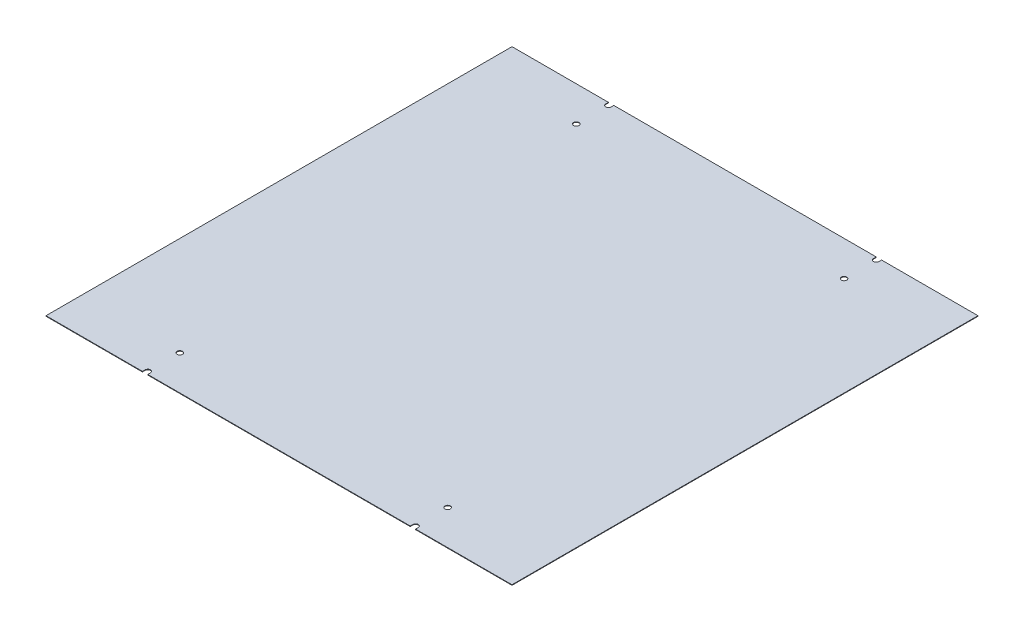
ISO-10303-21;
HEADER;
FILE_DESCRIPTION(('STEP AP214'),'2;1');
FILE_NAME('part.step','',(''),(''),'','','');
FILE_SCHEMA(('AUTOMOTIVE_DESIGN { 1 0 10303 214 1 1 1 1 }'));
ENDSEC;
DATA;
#1=APPLICATION_CONTEXT('core data for automotive mechanical design processes');
#2=APPLICATION_PROTOCOL_DEFINITION('international standard','automotive_design',2000,#1);
#3=PRODUCT_CONTEXT('',#1,'mechanical');
#4=PRODUCT('Part','Part','',(#3));
#5=PRODUCT_RELATED_PRODUCT_CATEGORY('part','',(#4));
#6=PRODUCT_DEFINITION_FORMATION('','',#4);
#7=PRODUCT_DEFINITION_CONTEXT('part definition',#1,'design');
#8=PRODUCT_DEFINITION('design','',#6,#7);
#9=PRODUCT_DEFINITION_SHAPE('','',#8);
#10=(LENGTH_UNIT() NAMED_UNIT(*) SI_UNIT(.MILLI.,.METRE.));
#11=(NAMED_UNIT(*) PLANE_ANGLE_UNIT() SI_UNIT($,.RADIAN.));
#12=(NAMED_UNIT(*) SI_UNIT($,.STERADIAN.) SOLID_ANGLE_UNIT());
#13=UNCERTAINTY_MEASURE_WITH_UNIT(LENGTH_MEASURE(1.E-05),#10,'distance_accuracy_value','');
#14=(GEOMETRIC_REPRESENTATION_CONTEXT(3) GLOBAL_UNCERTAINTY_ASSIGNED_CONTEXT((#13)) GLOBAL_UNIT_ASSIGNED_CONTEXT((#10,
#11,#12)) REPRESENTATION_CONTEXT('',''));
#15=CARTESIAN_POINT('',(0.,0.,0.));
#16=DIRECTION('',(0.,0.,1.));
#17=DIRECTION('',(1.,0.,0.));
#18=AXIS2_PLACEMENT_3D('',#15,#16,#17);
#19=CARTESIAN_POINT('',(490.000000000007,2.,4.08006961549746E-12));
#20=DIRECTION('',(1.,0.,0.));
#21=DIRECTION('',(0.,0.,-1.));
#22=AXIS2_PLACEMENT_3D('',#19,#20,#21);
#23=PLANE('',#22);
#24=DIRECTION('',(0.,0.,1.));
#25=VECTOR('',#24,1.);
#26=CARTESIAN_POINT('',(490.000000000007,0.,4.08006961549746E-12));
#27=LINE('',#26,#25);
#28=CARTESIAN_POINT('',(490.,0.,860.));
#29=VERTEX_POINT('',#28);
#30=CARTESIAN_POINT('',(490.,0.,870.));
#31=VERTEX_POINT('',#30);
#32=EDGE_CURVE('E428',#29,#31,#27,.T.);
#33=ORIENTED_EDGE('',*,*,#32,.F.);
#34=DIRECTION('',(0.,-1.,0.));
#35=VECTOR('',#34,1.);
#36=CARTESIAN_POINT('',(490.,2.,860.));
#37=LINE('',#36,#35);
#38=CARTESIAN_POINT('',(490.,2.,860.));
#39=VERTEX_POINT('',#38);
#40=EDGE_CURVE('E225',#29,#39,#37,.F.);
#41=ORIENTED_EDGE('',*,*,#40,.T.);
#42=DIRECTION('',(0.,0.,1.));
#43=VECTOR('',#42,1.);
#44=CARTESIAN_POINT('',(490.000000000007,2.,4.08006961549746E-12));
#45=LINE('',#44,#43);
#46=CARTESIAN_POINT('',(490.,2.,870.));
#47=VERTEX_POINT('',#46);
#48=EDGE_CURVE('E210',#39,#47,#45,.T.);
#49=ORIENTED_EDGE('',*,*,#48,.T.);
#50=DIRECTION('',(0.,-1.,0.));
#51=VECTOR('',#50,1.);
#52=CARTESIAN_POINT('',(490.,2.,870.));
#53=LINE('',#52,#51);
#54=EDGE_CURVE('E330',#47,#31,#53,.T.);
#55=ORIENTED_EDGE('',*,*,#54,.T.);
#56=EDGE_LOOP('',(#33,#41,#49,#55));
#57=FACE_BOUND('',#56,.T.);
#58=ADVANCED_FACE('F39',(#57),#23,.T.);
#59=CARTESIAN_POINT('',(510.00000000001,2.,5.66213742558834E-12));
#60=DIRECTION('',(1.,0.,0.));
#61=DIRECTION('',(0.,0.,-1.));
#62=AXIS2_PLACEMENT_3D('',#59,#60,#61);
#63=PLANE('',#62);
#64=DIRECTION('',(0.,0.,1.));
#65=VECTOR('',#64,1.);
#66=CARTESIAN_POINT('',(510.00000000001,2.,5.66213742558834E-12));
#67=LINE('',#66,#65);
#68=CARTESIAN_POINT('',(510.,2.,860.));
#69=VERTEX_POINT('',#68);
#70=CARTESIAN_POINT('',(510.,2.,870.));
#71=VERTEX_POINT('',#70);
#72=EDGE_CURVE('E199',#69,#71,#67,.T.);
#73=ORIENTED_EDGE('',*,*,#72,.F.);
#74=DIRECTION('',(0.,-1.,0.));
#75=VECTOR('',#74,1.);
#76=CARTESIAN_POINT('',(510.,0.,860.));
#77=LINE('',#76,#75);
#78=CARTESIAN_POINT('',(510.,0.,860.));
#79=VERTEX_POINT('',#78);
#80=EDGE_CURVE('E228',#69,#79,#77,.T.);
#81=ORIENTED_EDGE('',*,*,#80,.T.);
#82=DIRECTION('',(0.,0.,1.));
#83=VECTOR('',#82,1.);
#84=CARTESIAN_POINT('',(510.00000000001,0.,5.66213742558834E-12));
#85=LINE('',#84,#83);
#86=CARTESIAN_POINT('',(510.,0.,870.));
#87=VERTEX_POINT('',#86);
#88=EDGE_CURVE('E223',#79,#87,#85,.T.);
#89=ORIENTED_EDGE('',*,*,#88,.T.);
#90=DIRECTION('',(0.,-1.,0.));
#91=VECTOR('',#90,1.);
#92=CARTESIAN_POINT('',(510.,2.,870.));
#93=LINE('',#92,#91);
#94=EDGE_CURVE('E216',#71,#87,#93,.T.);
#95=ORIENTED_EDGE('',*,*,#94,.F.);
#96=EDGE_LOOP('',(#73,#81,#89,#95));
#97=FACE_BOUND('',#96,.T.);
#98=ADVANCED_FACE('F221',(#97),#63,.F.);
#99=CARTESIAN_POINT('',(0.,2.,870.));
#100=DIRECTION('',(0.,0.,-1.));
#101=DIRECTION('',(-1.,0.,0.));
#102=AXIS2_PLACEMENT_3D('',#99,#100,#101);
#103=PLANE('',#102);
#104=DIRECTION('',(1.,0.,0.));
#105=VECTOR('',#104,1.);
#106=CARTESIAN_POINT('',(0.,0.,870.));
#107=LINE('',#106,#105);
#108=CARTESIAN_POINT('',(870.,0.,870.));
#109=VERTEX_POINT('',#108);
#110=EDGE_CURVE('E364',#87,#109,#107,.T.);
#111=ORIENTED_EDGE('',*,*,#110,.T.);
#112=DIRECTION('',(0.,-1.,0.));
#113=VECTOR('',#112,1.);
#114=CARTESIAN_POINT('',(870.,2.,870.));
#115=LINE('',#114,#113);
#116=CARTESIAN_POINT('',(870.,2.,870.));
#117=VERTEX_POINT('',#116);
#118=EDGE_CURVE('E217',#117,#109,#115,.T.);
#119=ORIENTED_EDGE('',*,*,#118,.F.);
#120=DIRECTION('',(1.,0.,0.));
#121=VECTOR('',#120,1.);
#122=CARTESIAN_POINT('',(0.,2.,870.));
#123=LINE('',#122,#121);
#124=EDGE_CURVE('E203',#71,#117,#123,.T.);
#125=ORIENTED_EDGE('',*,*,#124,.F.);
#126=ORIENTED_EDGE('',*,*,#94,.T.);
#127=EDGE_LOOP('',(#111,#119,#125,#126));
#128=FACE_BOUND('',#127,.T.);
#129=ADVANCED_FACE('F215',(#128),#103,.F.);
#130=CARTESIAN_POINT('',(870.,2.,-1.11022302462516E-13));
#131=DIRECTION('',(1.,0.,0.));
#132=DIRECTION('',(0.,0.,-1.));
#133=AXIS2_PLACEMENT_3D('',#130,#131,#132);
#134=PLANE('',#133);
#135=DIRECTION('',(0.,0.,1.));
#136=VECTOR('',#135,1.);
#137=CARTESIAN_POINT('',(870.,0.,-1.11022302462516E-13));
#138=LINE('',#137,#136);
#139=CARTESIAN_POINT('',(870.,0.,-870.));
#140=VERTEX_POINT('',#139);
#141=EDGE_CURVE('E362',#140,#109,#138,.T.);
#142=ORIENTED_EDGE('',*,*,#141,.F.);
#143=DIRECTION('',(0.,-1.,0.));
#144=VECTOR('',#143,1.);
#145=CARTESIAN_POINT('',(870.,2.,-870.));
#146=LINE('',#145,#144);
#147=CARTESIAN_POINT('',(870.,2.,-870.));
#148=VERTEX_POINT('',#147);
#149=EDGE_CURVE('E230',#148,#140,#146,.T.);
#150=ORIENTED_EDGE('',*,*,#149,.F.);
#151=DIRECTION('',(0.,0.,1.));
#152=VECTOR('',#151,1.);
#153=CARTESIAN_POINT('',(870.,2.,-1.11022302462516E-13));
#154=LINE('',#153,#152);
#155=EDGE_CURVE('E219',#148,#117,#154,.T.);
#156=ORIENTED_EDGE('',*,*,#155,.T.);
#157=ORIENTED_EDGE('',*,*,#118,.T.);
#158=EDGE_LOOP('',(#142,#150,#156,#157));
#159=FACE_BOUND('',#158,.T.);
#160=ADVANCED_FACE('F363',(#159),#134,.T.);
#161=CARTESIAN_POINT('',(0.,2.,-870.));
#162=DIRECTION('',(0.,0.,-1.));
#163=DIRECTION('',(-1.,0.,0.));
#164=AXIS2_PLACEMENT_3D('',#161,#162,#163);
#165=PLANE('',#164);
#166=DIRECTION('',(1.,0.,0.));
#167=VECTOR('',#166,1.);
#168=CARTESIAN_POINT('',(0.,0.,-870.));
#169=LINE('',#168,#167);
#170=CARTESIAN_POINT('',(510.,0.,-870.));
#171=VERTEX_POINT('',#170);
#172=EDGE_CURVE('E357',#171,#140,#169,.T.);
#173=ORIENTED_EDGE('',*,*,#172,.F.);
#174=DIRECTION('',(0.,-1.,0.));
#175=VECTOR('',#174,1.);
#176=CARTESIAN_POINT('',(510.,2.,-870.));
#177=LINE('',#176,#175);
#178=CARTESIAN_POINT('',(510.,2.,-870.));
#179=VERTEX_POINT('',#178);
#180=EDGE_CURVE('E350',#179,#171,#177,.T.);
#181=ORIENTED_EDGE('',*,*,#180,.F.);
#182=DIRECTION('',(1.,0.,0.));
#183=VECTOR('',#182,1.);
#184=CARTESIAN_POINT('',(0.,2.,-870.));
#185=LINE('',#184,#183);
#186=EDGE_CURVE('E359',#179,#148,#185,.T.);
#187=ORIENTED_EDGE('',*,*,#186,.T.);
#188=ORIENTED_EDGE('',*,*,#149,.T.);
#189=EDGE_LOOP('',(#173,#181,#187,#188));
#190=FACE_BOUND('',#189,.T.);
#191=ADVANCED_FACE('F355',(#190),#165,.T.);
#192=CARTESIAN_POINT('',(509.99999999999,2.,5.66213742558812E-12));
#193=DIRECTION('',(1.,0.,0.));
#194=DIRECTION('',(0.,0.,-1.));
#195=AXIS2_PLACEMENT_3D('',#192,#193,#194);
#196=PLANE('',#195);
#197=DIRECTION('',(0.,0.,1.));
#198=VECTOR('',#197,1.);
#199=CARTESIAN_POINT('',(509.99999999999,0.,5.66213742558812E-12));
#200=LINE('',#199,#198);
#201=CARTESIAN_POINT('',(510.,0.,-860.));
#202=VERTEX_POINT('',#201);
#203=EDGE_CURVE('E368',#171,#202,#200,.T.);
#204=ORIENTED_EDGE('',*,*,#203,.T.);
#205=DIRECTION('',(0.,-1.,0.));
#206=VECTOR('',#205,1.);
#207=CARTESIAN_POINT('',(510.,2.,-860.));
#208=LINE('',#207,#206);
#209=CARTESIAN_POINT('',(510.,2.,-860.));
#210=VERTEX_POINT('',#209);
#211=EDGE_CURVE('E240',#202,#210,#208,.F.);
#212=ORIENTED_EDGE('',*,*,#211,.T.);
#213=DIRECTION('',(0.,0.,1.));
#214=VECTOR('',#213,1.);
#215=CARTESIAN_POINT('',(509.99999999999,2.,5.66213742558812E-12));
#216=LINE('',#215,#214);
#217=EDGE_CURVE('E386',#179,#210,#216,.T.);
#218=ORIENTED_EDGE('',*,*,#217,.F.);
#219=ORIENTED_EDGE('',*,*,#180,.T.);
#220=EDGE_LOOP('',(#204,#212,#218,#219));
#221=FACE_BOUND('',#220,.T.);
#222=ADVANCED_FACE('F383',(#221),#196,.F.);
#223=CARTESIAN_POINT('',(489.999999999993,2.,4.08006961549734E-12));
#224=DIRECTION('',(1.,0.,0.));
#225=DIRECTION('',(0.,0.,-1.));
#226=AXIS2_PLACEMENT_3D('',#223,#224,#225);
#227=PLANE('',#226);
#228=DIRECTION('',(0.,0.,1.));
#229=VECTOR('',#228,1.);
#230=CARTESIAN_POINT('',(489.999999999993,2.,4.08006961549734E-12));
#231=LINE('',#230,#229);
#232=CARTESIAN_POINT('',(490.,2.,-870.));
#233=VERTEX_POINT('',#232);
#234=CARTESIAN_POINT('',(490.,2.,-860.));
#235=VERTEX_POINT('',#234);
#236=EDGE_CURVE('E387',#233,#235,#231,.T.);
#237=ORIENTED_EDGE('',*,*,#236,.T.);
#238=DIRECTION('',(0.,-1.,0.));
#239=VECTOR('',#238,1.);
#240=CARTESIAN_POINT('',(490.,0.,-860.));
#241=LINE('',#240,#239);
#242=CARTESIAN_POINT('',(490.,0.,-860.));
#243=VERTEX_POINT('',#242);
#244=EDGE_CURVE('E243',#235,#243,#241,.T.);
#245=ORIENTED_EDGE('',*,*,#244,.T.);
#246=DIRECTION('',(0.,0.,1.));
#247=VECTOR('',#246,1.);
#248=CARTESIAN_POINT('',(489.999999999993,0.,4.08006961549734E-12));
#249=LINE('',#248,#247);
#250=CARTESIAN_POINT('',(490.,0.,-870.));
#251=VERTEX_POINT('',#250);
#252=EDGE_CURVE('E310',#251,#243,#249,.T.);
#253=ORIENTED_EDGE('',*,*,#252,.F.);
#254=DIRECTION('',(0.,-1.,0.));
#255=VECTOR('',#254,1.);
#256=CARTESIAN_POINT('',(490.,2.,-870.));
#257=LINE('',#256,#255);
#258=EDGE_CURVE('E348',#233,#251,#257,.T.);
#259=ORIENTED_EDGE('',*,*,#258,.F.);
#260=EDGE_LOOP('',(#237,#245,#253,#259));
#261=FACE_BOUND('',#260,.T.);
#262=ADVANCED_FACE('F629',(#261),#227,.T.);
#263=CARTESIAN_POINT('',(-1.97121230902834E-13,2.,-870.));
#264=DIRECTION('',(0.,0.,-1.));
#265=DIRECTION('',(-1.,0.,0.));
#266=AXIS2_PLACEMENT_3D('',#263,#264,#265);
#267=PLANE('',#266);
#268=DIRECTION('',(1.,0.,0.));
#269=VECTOR('',#268,1.);
#270=CARTESIAN_POINT('',(-1.97121230902834E-13,0.,-870.));
#271=LINE('',#270,#269);
#272=CARTESIAN_POINT('',(-490.,0.,-870.));
#273=VERTEX_POINT('',#272);
#274=EDGE_CURVE('E306',#273,#251,#271,.T.);
#275=ORIENTED_EDGE('',*,*,#274,.F.);
#276=DIRECTION('',(0.,-1.,0.));
#277=VECTOR('',#276,1.);
#278=CARTESIAN_POINT('',(-490.,2.,-870.));
#279=LINE('',#278,#277);
#280=CARTESIAN_POINT('',(-490.,2.,-870.));
#281=VERTEX_POINT('',#280);
#282=EDGE_CURVE('E304',#281,#273,#279,.T.);
#283=ORIENTED_EDGE('',*,*,#282,.F.);
#284=DIRECTION('',(1.,0.,0.));
#285=VECTOR('',#284,1.);
#286=CARTESIAN_POINT('',(-1.97121230902834E-13,2.,-870.));
#287=LINE('',#286,#285);
#288=EDGE_CURVE('E394',#281,#233,#287,.T.);
#289=ORIENTED_EDGE('',*,*,#288,.T.);
#290=ORIENTED_EDGE('',*,*,#258,.T.);
#291=EDGE_LOOP('',(#275,#283,#289,#290));
#292=FACE_BOUND('',#291,.T.);
#293=ADVANCED_FACE('F624',(#292),#267,.T.);
#294=CARTESIAN_POINT('',(-490.,2.,0.));
#295=DIRECTION('',(1.,0.,0.));
#296=DIRECTION('',(0.,0.,-1.));
#297=AXIS2_PLACEMENT_3D('',#294,#295,#296);
#298=PLANE('',#297);
#299=DIRECTION('',(0.,0.,1.));
#300=VECTOR('',#299,1.);
#301=CARTESIAN_POINT('',(-490.,0.,0.));
#302=LINE('',#301,#300);
#303=CARTESIAN_POINT('',(-490.,0.,-860.));
#304=VERTEX_POINT('',#303);
#305=EDGE_CURVE('E299',#273,#304,#302,.T.);
#306=ORIENTED_EDGE('',*,*,#305,.T.);
#307=DIRECTION('',(0.,-1.,0.));
#308=VECTOR('',#307,1.);
#309=CARTESIAN_POINT('',(-490.,2.,-860.));
#310=LINE('',#309,#308);
#311=CARTESIAN_POINT('',(-490.,2.,-860.));
#312=VERTEX_POINT('',#311);
#313=EDGE_CURVE('E248',#304,#312,#310,.F.);
#314=ORIENTED_EDGE('',*,*,#313,.T.);
#315=DIRECTION('',(0.,0.,1.));
#316=VECTOR('',#315,1.);
#317=CARTESIAN_POINT('',(-490.,2.,0.));
#318=LINE('',#317,#316);
#319=EDGE_CURVE('E397',#281,#312,#318,.T.);
#320=ORIENTED_EDGE('',*,*,#319,.F.);
#321=ORIENTED_EDGE('',*,*,#282,.T.);
#322=EDGE_LOOP('',(#306,#314,#320,#321));
#323=FACE_BOUND('',#322,.T.);
#324=ADVANCED_FACE('F302',(#323),#298,.F.);
#325=CARTESIAN_POINT('',(-510.,2.,0.));
#326=DIRECTION('',(1.,0.,0.));
#327=DIRECTION('',(0.,0.,-1.));
#328=AXIS2_PLACEMENT_3D('',#325,#326,#327);
#329=PLANE('',#328);
#330=DIRECTION('',(0.,0.,1.));
#331=VECTOR('',#330,1.);
#332=CARTESIAN_POINT('',(-510.,2.,0.));
#333=LINE('',#332,#331);
#334=CARTESIAN_POINT('',(-510.,2.,-870.));
#335=VERTEX_POINT('',#334);
#336=CARTESIAN_POINT('',(-510.,2.,-860.));
#337=VERTEX_POINT('',#336);
#338=EDGE_CURVE('E399',#335,#337,#333,.T.);
#339=ORIENTED_EDGE('',*,*,#338,.T.);
#340=DIRECTION('',(0.,-1.,0.));
#341=VECTOR('',#340,1.);
#342=CARTESIAN_POINT('',(-510.,0.,-860.));
#343=LINE('',#342,#341);
#344=CARTESIAN_POINT('',(-510.,0.,-860.));
#345=VERTEX_POINT('',#344);
#346=EDGE_CURVE('E245',#337,#345,#343,.T.);
#347=ORIENTED_EDGE('',*,*,#346,.T.);
#348=DIRECTION('',(0.,0.,1.));
#349=VECTOR('',#348,1.);
#350=CARTESIAN_POINT('',(-510.,0.,0.));
#351=LINE('',#350,#349);
#352=CARTESIAN_POINT('',(-510.,0.,-870.));
#353=VERTEX_POINT('',#352);
#354=EDGE_CURVE('E305',#353,#345,#351,.T.);
#355=ORIENTED_EDGE('',*,*,#354,.F.);
#356=DIRECTION('',(0.,-1.,0.));
#357=VECTOR('',#356,1.);
#358=CARTESIAN_POINT('',(-510.,2.,-870.));
#359=LINE('',#358,#357);
#360=EDGE_CURVE('E345',#335,#353,#359,.T.);
#361=ORIENTED_EDGE('',*,*,#360,.F.);
#362=EDGE_LOOP('',(#339,#347,#355,#361));
#363=FACE_BOUND('',#362,.T.);
#364=ADVANCED_FACE('F477',(#363),#329,.T.);
#365=CARTESIAN_POINT('',(5.36607795235492E-13,2.,-870.));
#366=DIRECTION('',(0.,0.,-1.));
#367=DIRECTION('',(-1.,0.,0.));
#368=AXIS2_PLACEMENT_3D('',#365,#366,#367);
#369=PLANE('',#368);
#370=DIRECTION('',(1.,0.,0.));
#371=VECTOR('',#370,1.);
#372=CARTESIAN_POINT('',(5.36607795235492E-13,0.,-870.));
#373=LINE('',#372,#371);
#374=CARTESIAN_POINT('',(-870.,0.,-870.));
#375=VERTEX_POINT('',#374);
#376=EDGE_CURVE('E308',#375,#353,#373,.T.);
#377=ORIENTED_EDGE('',*,*,#376,.F.);
#378=DIRECTION('',(0.,-1.,0.));
#379=VECTOR('',#378,1.);
#380=CARTESIAN_POINT('',(-870.,2.,-870.));
#381=LINE('',#380,#379);
#382=CARTESIAN_POINT('',(-870.,2.,-870.));
#383=VERTEX_POINT('',#382);
#384=EDGE_CURVE('E343',#383,#375,#381,.T.);
#385=ORIENTED_EDGE('',*,*,#384,.F.);
#386=DIRECTION('',(1.,0.,0.));
#387=VECTOR('',#386,1.);
#388=CARTESIAN_POINT('',(5.36607795235492E-13,2.,-870.));
#389=LINE('',#388,#387);
#390=EDGE_CURVE('E402',#383,#335,#389,.T.);
#391=ORIENTED_EDGE('',*,*,#390,.T.);
#392=ORIENTED_EDGE('',*,*,#360,.T.);
#393=EDGE_LOOP('',(#377,#385,#391,#392));
#394=FACE_BOUND('',#393,.T.);
#395=ADVANCED_FACE('F471',(#394),#369,.T.);
#396=CARTESIAN_POINT('',(-870.,2.,1.11022302462516E-13));
#397=DIRECTION('',(1.,0.,0.));
#398=DIRECTION('',(0.,0.,-1.));
#399=AXIS2_PLACEMENT_3D('',#396,#397,#398);
#400=PLANE('',#399);
#401=DIRECTION('',(0.,0.,1.));
#402=VECTOR('',#401,1.);
#403=CARTESIAN_POINT('',(-870.,0.,1.11022302462516E-13));
#404=LINE('',#403,#402);
#405=CARTESIAN_POINT('',(-870.,0.,870.));
#406=VERTEX_POINT('',#405);
#407=EDGE_CURVE('E316',#375,#406,#404,.T.);
#408=ORIENTED_EDGE('',*,*,#407,.T.);
#409=DIRECTION('',(0.,-1.,0.));
#410=VECTOR('',#409,1.);
#411=CARTESIAN_POINT('',(-870.,2.,870.));
#412=LINE('',#411,#410);
#413=CARTESIAN_POINT('',(-870.,2.,870.));
#414=VERTEX_POINT('',#413);
#415=EDGE_CURVE('E340',#414,#406,#412,.T.);
#416=ORIENTED_EDGE('',*,*,#415,.F.);
#417=DIRECTION('',(0.,0.,1.));
#418=VECTOR('',#417,1.);
#419=CARTESIAN_POINT('',(-870.,2.,1.11022302462516E-13));
#420=LINE('',#419,#418);
#421=EDGE_CURVE('E405',#383,#414,#420,.T.);
#422=ORIENTED_EDGE('',*,*,#421,.F.);
#423=ORIENTED_EDGE('',*,*,#384,.T.);
#424=EDGE_LOOP('',(#408,#416,#422,#423));
#425=FACE_BOUND('',#424,.T.);
#426=ADVANCED_FACE('F478',(#425),#400,.F.);
#427=CARTESIAN_POINT('',(0.,2.,870.));
#428=DIRECTION('',(0.,0.,-1.));
#429=DIRECTION('',(-1.,0.,0.));
#430=AXIS2_PLACEMENT_3D('',#427,#428,#429);
#431=PLANE('',#430);
#432=DIRECTION('',(1.,0.,0.));
#433=VECTOR('',#432,1.);
#434=CARTESIAN_POINT('',(0.,0.,870.));
#435=LINE('',#434,#433);
#436=CARTESIAN_POINT('',(-510.,0.,870.));
#437=VERTEX_POINT('',#436);
#438=EDGE_CURVE('E319',#406,#437,#435,.T.);
#439=ORIENTED_EDGE('',*,*,#438,.T.);
#440=DIRECTION('',(0.,-1.,0.));
#441=VECTOR('',#440,1.);
#442=CARTESIAN_POINT('',(-510.,2.,870.));
#443=LINE('',#442,#441);
#444=CARTESIAN_POINT('',(-510.,2.,870.));
#445=VERTEX_POINT('',#444);
#446=EDGE_CURVE('E337',#445,#437,#443,.T.);
#447=ORIENTED_EDGE('',*,*,#446,.F.);
#448=DIRECTION('',(1.,0.,0.));
#449=VECTOR('',#448,1.);
#450=CARTESIAN_POINT('',(0.,2.,870.));
#451=LINE('',#450,#449);
#452=EDGE_CURVE('E408',#414,#445,#451,.T.);
#453=ORIENTED_EDGE('',*,*,#452,.F.);
#454=ORIENTED_EDGE('',*,*,#415,.T.);
#455=EDGE_LOOP('',(#439,#447,#453,#454));
#456=FACE_BOUND('',#455,.T.);
#457=ADVANCED_FACE('F465',(#456),#431,.F.);
#458=CARTESIAN_POINT('',(-510.,2.,0.));
#459=DIRECTION('',(1.,0.,0.));
#460=DIRECTION('',(0.,0.,-1.));
#461=AXIS2_PLACEMENT_3D('',#458,#459,#460);
#462=PLANE('',#461);
#463=DIRECTION('',(0.,0.,1.));
#464=VECTOR('',#463,1.);
#465=CARTESIAN_POINT('',(-510.,0.,0.));
#466=LINE('',#465,#464);
#467=CARTESIAN_POINT('',(-510.,0.,860.));
#468=VERTEX_POINT('',#467);
#469=EDGE_CURVE('E322',#468,#437,#466,.T.);
#470=ORIENTED_EDGE('',*,*,#469,.F.);
#471=DIRECTION('',(0.,-1.,0.));
#472=VECTOR('',#471,1.);
#473=CARTESIAN_POINT('',(-510.,2.,860.));
#474=LINE('',#473,#472);
#475=CARTESIAN_POINT('',(-510.,2.,860.));
#476=VERTEX_POINT('',#475);
#477=EDGE_CURVE('E235',#468,#476,#474,.F.);
#478=ORIENTED_EDGE('',*,*,#477,.T.);
#479=DIRECTION('',(0.,0.,1.));
#480=VECTOR('',#479,1.);
#481=CARTESIAN_POINT('',(-510.,2.,0.));
#482=LINE('',#481,#480);
#483=EDGE_CURVE('E411',#476,#445,#482,.T.);
#484=ORIENTED_EDGE('',*,*,#483,.T.);
#485=ORIENTED_EDGE('',*,*,#446,.T.);
#486=EDGE_LOOP('',(#470,#478,#484,#485));
#487=FACE_BOUND('',#486,.T.);
#488=ADVANCED_FACE('F461',(#487),#462,.T.);
#489=CARTESIAN_POINT('',(-490.,2.,0.));
#490=DIRECTION('',(1.,0.,0.));
#491=DIRECTION('',(0.,0.,-1.));
#492=AXIS2_PLACEMENT_3D('',#489,#490,#491);
#493=PLANE('',#492);
#494=DIRECTION('',(0.,0.,1.));
#495=VECTOR('',#494,1.);
#496=CARTESIAN_POINT('',(-490.,2.,0.));
#497=LINE('',#496,#495);
#498=CARTESIAN_POINT('',(-490.,2.,860.));
#499=VERTEX_POINT('',#498);
#500=CARTESIAN_POINT('',(-490.,2.,870.));
#501=VERTEX_POINT('',#500);
#502=EDGE_CURVE('E413',#499,#501,#497,.T.);
#503=ORIENTED_EDGE('',*,*,#502,.F.);
#504=DIRECTION('',(0.,-1.,0.));
#505=VECTOR('',#504,1.);
#506=CARTESIAN_POINT('',(-490.,0.,860.));
#507=LINE('',#506,#505);
#508=CARTESIAN_POINT('',(-490.,0.,860.));
#509=VERTEX_POINT('',#508);
#510=EDGE_CURVE('E238',#499,#509,#507,.T.);
#511=ORIENTED_EDGE('',*,*,#510,.T.);
#512=DIRECTION('',(0.,0.,1.));
#513=VECTOR('',#512,1.);
#514=CARTESIAN_POINT('',(-490.,0.,0.));
#515=LINE('',#514,#513);
#516=CARTESIAN_POINT('',(-490.,0.,870.));
#517=VERTEX_POINT('',#516);
#518=EDGE_CURVE('E324',#509,#517,#515,.T.);
#519=ORIENTED_EDGE('',*,*,#518,.T.);
#520=DIRECTION('',(0.,-1.,0.));
#521=VECTOR('',#520,1.);
#522=CARTESIAN_POINT('',(-490.,2.,870.));
#523=LINE('',#522,#521);
#524=EDGE_CURVE('E333',#501,#517,#523,.T.);
#525=ORIENTED_EDGE('',*,*,#524,.F.);
#526=EDGE_LOOP('',(#503,#511,#519,#525));
#527=FACE_BOUND('',#526,.T.);
#528=ADVANCED_FACE('F499',(#527),#493,.F.);
#529=CARTESIAN_POINT('',(-500.,2.,740.));
#530=DIRECTION('',(0.,-1.,0.));
#531=DIRECTION('',(0.,0.,-1.));
#532=AXIS2_PLACEMENT_3D('',#529,#530,#531);
#533=CYLINDRICAL_SURFACE('',#532,9.99999999999998);
#534=CARTESIAN_POINT('',(-500.,2.,740.));
#535=DIRECTION('',(0.,1.,0.));
#536=DIRECTION('',(0.,0.,1.));
#537=AXIS2_PLACEMENT_3D('',#534,#535,#536);
#538=CIRCLE('',#537,9.99999999999998);
#539=CARTESIAN_POINT('',(-500.,2.,750.));
#540=VERTEX_POINT('',#539);
#541=EDGE_CURVE('E752',#540,#540,#538,.T.);
#542=ORIENTED_EDGE('',*,*,#541,.T.);
#543=EDGE_LOOP('',(#542));
#544=FACE_BOUND('',#543,.T.);
#545=CARTESIAN_POINT('',(-500.,0.,740.));
#546=DIRECTION('',(0.,1.,0.));
#547=DIRECTION('',(0.,0.,1.));
#548=AXIS2_PLACEMENT_3D('',#545,#546,#547);
#549=CIRCLE('',#548,9.99999999999998);
#550=CARTESIAN_POINT('',(-500.,0.,750.));
#551=VERTEX_POINT('',#550);
#552=EDGE_CURVE('E425',#551,#551,#549,.T.);
#553=ORIENTED_EDGE('',*,*,#552,.F.);
#554=EDGE_LOOP('',(#553));
#555=FACE_BOUND('',#554,.T.);
#556=ADVANCED_FACE('F495',(#544,#555),#533,.F.);
#557=CARTESIAN_POINT('',(500.,2.,740.));
#558=DIRECTION('',(0.,-1.,0.));
#559=DIRECTION('',(0.,0.,-1.));
#560=AXIS2_PLACEMENT_3D('',#557,#558,#559);
#561=CYLINDRICAL_SURFACE('',#560,9.99999999999998);
#562=CARTESIAN_POINT('',(500.,2.,740.));
#563=DIRECTION('',(0.,1.,0.));
#564=DIRECTION('',(0.,0.,1.));
#565=AXIS2_PLACEMENT_3D('',#562,#563,#564);
#566=CIRCLE('',#565,9.99999999999998);
#567=CARTESIAN_POINT('',(500.,2.,750.));
#568=VERTEX_POINT('',#567);
#569=EDGE_CURVE('E755',#568,#568,#566,.T.);
#570=ORIENTED_EDGE('',*,*,#569,.T.);
#571=EDGE_LOOP('',(#570));
#572=FACE_BOUND('',#571,.T.);
#573=CARTESIAN_POINT('',(500.,0.,740.));
#574=DIRECTION('',(0.,1.,0.));
#575=DIRECTION('',(0.,0.,1.));
#576=AXIS2_PLACEMENT_3D('',#573,#574,#575);
#577=CIRCLE('',#576,9.99999999999998);
#578=CARTESIAN_POINT('',(500.,0.,750.));
#579=VERTEX_POINT('',#578);
#580=EDGE_CURVE('E422',#579,#579,#577,.T.);
#581=ORIENTED_EDGE('',*,*,#580,.F.);
#582=EDGE_LOOP('',(#581));
#583=FACE_BOUND('',#582,.T.);
#584=ADVANCED_FACE('F498',(#572,#583),#561,.F.);
#585=CARTESIAN_POINT('',(500.,2.,-740.));
#586=DIRECTION('',(0.,-1.,0.));
#587=DIRECTION('',(0.,0.,-1.));
#588=AXIS2_PLACEMENT_3D('',#585,#586,#587);
#589=CYLINDRICAL_SURFACE('',#588,9.99999999999998);
#590=CARTESIAN_POINT('',(500.,2.,-740.));
#591=DIRECTION('',(0.,1.,0.));
#592=DIRECTION('',(0.,0.,1.));
#593=AXIS2_PLACEMENT_3D('',#590,#591,#592);
#594=CIRCLE('',#593,9.99999999999998);
#595=CARTESIAN_POINT('',(500.,2.,-730.));
#596=VERTEX_POINT('',#595);
#597=EDGE_CURVE('E760',#596,#596,#594,.T.);
#598=ORIENTED_EDGE('',*,*,#597,.T.);
#599=EDGE_LOOP('',(#598));
#600=FACE_BOUND('',#599,.T.);
#601=CARTESIAN_POINT('',(500.,0.,-740.));
#602=DIRECTION('',(0.,1.,0.));
#603=DIRECTION('',(0.,0.,1.));
#604=AXIS2_PLACEMENT_3D('',#601,#602,#603);
#605=CIRCLE('',#604,9.99999999999998);
#606=CARTESIAN_POINT('',(500.,0.,-730.));
#607=VERTEX_POINT('',#606);
#608=EDGE_CURVE('E419',#607,#607,#605,.T.);
#609=ORIENTED_EDGE('',*,*,#608,.F.);
#610=EDGE_LOOP('',(#609));
#611=FACE_BOUND('',#610,.T.);
#612=ADVANCED_FACE('F503',(#600,#611),#589,.F.);
#613=CARTESIAN_POINT('',(-500.,2.,-740.));
#614=DIRECTION('',(0.,-1.,0.));
#615=DIRECTION('',(0.,0.,-1.));
#616=AXIS2_PLACEMENT_3D('',#613,#614,#615);
#617=CYLINDRICAL_SURFACE('',#616,9.99999999999998);
#618=CARTESIAN_POINT('',(-500.,2.,-740.));
#619=DIRECTION('',(0.,1.,0.));
#620=DIRECTION('',(0.,0.,1.));
#621=AXIS2_PLACEMENT_3D('',#618,#619,#620);
#622=CIRCLE('',#621,9.99999999999998);
#623=CARTESIAN_POINT('',(-500.,2.,-730.));
#624=VERTEX_POINT('',#623);
#625=EDGE_CURVE('E329',#624,#624,#622,.T.);
#626=ORIENTED_EDGE('',*,*,#625,.T.);
#627=EDGE_LOOP('',(#626));
#628=FACE_BOUND('',#627,.T.);
#629=CARTESIAN_POINT('',(-500.,0.,-740.));
#630=DIRECTION('',(0.,1.,0.));
#631=DIRECTION('',(0.,0.,1.));
#632=AXIS2_PLACEMENT_3D('',#629,#630,#631);
#633=CIRCLE('',#632,9.99999999999998);
#634=CARTESIAN_POINT('',(-500.,0.,-730.));
#635=VERTEX_POINT('',#634);
#636=EDGE_CURVE('E280',#635,#635,#633,.T.);
#637=ORIENTED_EDGE('',*,*,#636,.F.);
#638=EDGE_LOOP('',(#637));
#639=FACE_BOUND('',#638,.T.);
#640=ADVANCED_FACE('F507',(#628,#639),#617,.F.);
#641=CARTESIAN_POINT('',(0.,2.,870.));
#642=DIRECTION('',(0.,0.,-1.));
#643=DIRECTION('',(-1.,0.,0.));
#644=AXIS2_PLACEMENT_3D('',#641,#642,#643);
#645=PLANE('',#644);
#646=DIRECTION('',(1.,0.,0.));
#647=VECTOR('',#646,1.);
#648=CARTESIAN_POINT('',(0.,0.,870.));
#649=LINE('',#648,#647);
#650=EDGE_CURVE('E326',#517,#31,#649,.T.);
#651=ORIENTED_EDGE('',*,*,#650,.T.);
#652=ORIENTED_EDGE('',*,*,#54,.F.);
#653=DIRECTION('',(1.,0.,0.));
#654=VECTOR('',#653,1.);
#655=CARTESIAN_POINT('',(0.,2.,870.));
#656=LINE('',#655,#654);
#657=EDGE_CURVE('E334',#501,#47,#656,.T.);
#658=ORIENTED_EDGE('',*,*,#657,.F.);
#659=ORIENTED_EDGE('',*,*,#524,.T.);
#660=EDGE_LOOP('',(#651,#652,#658,#659));
#661=FACE_BOUND('',#660,.T.);
#662=ADVANCED_FACE('F445',(#661),#645,.F.);
#663=CARTESIAN_POINT('',(0.,2.,0.));
#664=DIRECTION('',(0.,1.,0.));
#665=DIRECTION('',(0.,0.,1.));
#666=AXIS2_PLACEMENT_3D('',#663,#664,#665);
#667=PLANE('',#666);
#668=ORIENTED_EDGE('',*,*,#625,.F.);
#669=EDGE_LOOP('',(#668));
#670=FACE_BOUND('',#669,.T.);
#671=ORIENTED_EDGE('',*,*,#597,.F.);
#672=EDGE_LOOP('',(#671));
#673=FACE_BOUND('',#672,.T.);
#674=ORIENTED_EDGE('',*,*,#569,.F.);
#675=EDGE_LOOP('',(#674));
#676=FACE_BOUND('',#675,.T.);
#677=ORIENTED_EDGE('',*,*,#541,.F.);
#678=EDGE_LOOP('',(#677));
#679=FACE_BOUND('',#678,.T.);
#680=CARTESIAN_POINT('',(500.,2.,860.));
#681=DIRECTION('',(0.,1.,0.));
#682=DIRECTION('',(0.,0.,1.));
#683=AXIS2_PLACEMENT_3D('',#680,#681,#682);
#684=CIRCLE('',#683,10.);
#685=CARTESIAN_POINT('',(500.,2.,850.));
#686=VERTEX_POINT('',#685);
#687=EDGE_CURVE('E252',#39,#686,#684,.F.);
#688=ORIENTED_EDGE('',*,*,#687,.T.);
#689=CARTESIAN_POINT('',(500.,2.,860.));
#690=DIRECTION('',(0.,1.,0.));
#691=DIRECTION('',(0.,0.,1.));
#692=AXIS2_PLACEMENT_3D('',#689,#690,#691);
#693=CIRCLE('',#692,10.);
#694=EDGE_CURVE('E206',#686,#69,#693,.F.);
#695=ORIENTED_EDGE('',*,*,#694,.T.);
#696=ORIENTED_EDGE('',*,*,#72,.T.);
#697=ORIENTED_EDGE('',*,*,#124,.T.);
#698=ORIENTED_EDGE('',*,*,#155,.F.);
#699=ORIENTED_EDGE('',*,*,#186,.F.);
#700=ORIENTED_EDGE('',*,*,#217,.T.);
#701=CARTESIAN_POINT('',(500.,2.,-860.));
#702=DIRECTION('',(0.,1.,0.));
#703=DIRECTION('',(0.,0.,1.));
#704=AXIS2_PLACEMENT_3D('',#701,#702,#703);
#705=CIRCLE('',#704,10.);
#706=CARTESIAN_POINT('',(500.,2.,-850.));
#707=VERTEX_POINT('',#706);
#708=EDGE_CURVE('E267',#210,#707,#705,.F.);
#709=ORIENTED_EDGE('',*,*,#708,.T.);
#710=CARTESIAN_POINT('',(500.,2.,-860.));
#711=DIRECTION('',(0.,1.,0.));
#712=DIRECTION('',(0.,0.,1.));
#713=AXIS2_PLACEMENT_3D('',#710,#711,#712);
#714=CIRCLE('',#713,10.);
#715=EDGE_CURVE('E271',#707,#235,#714,.F.);
#716=ORIENTED_EDGE('',*,*,#715,.T.);
#717=ORIENTED_EDGE('',*,*,#236,.F.);
#718=ORIENTED_EDGE('',*,*,#288,.F.);
#719=ORIENTED_EDGE('',*,*,#319,.T.);
#720=CARTESIAN_POINT('',(-500.,2.,-860.));
#721=DIRECTION('',(0.,1.,0.));
#722=DIRECTION('',(0.,0.,1.));
#723=AXIS2_PLACEMENT_3D('',#720,#721,#722);
#724=CIRCLE('',#723,10.);
#725=CARTESIAN_POINT('',(-500.,2.,-850.));
#726=VERTEX_POINT('',#725);
#727=EDGE_CURVE('E11',#312,#726,#724,.F.);
#728=ORIENTED_EDGE('',*,*,#727,.T.);
#729=CARTESIAN_POINT('',(-500.,2.,-860.));
#730=DIRECTION('',(0.,1.,0.));
#731=DIRECTION('',(0.,0.,1.));
#732=AXIS2_PLACEMENT_3D('',#729,#730,#731);
#733=CIRCLE('',#732,10.);
#734=EDGE_CURVE('E274',#726,#337,#733,.F.);
#735=ORIENTED_EDGE('',*,*,#734,.T.);
#736=ORIENTED_EDGE('',*,*,#338,.F.);
#737=ORIENTED_EDGE('',*,*,#390,.F.);
#738=ORIENTED_EDGE('',*,*,#421,.T.);
#739=ORIENTED_EDGE('',*,*,#452,.T.);
#740=ORIENTED_EDGE('',*,*,#483,.F.);
#741=CARTESIAN_POINT('',(-500.,2.,860.));
#742=DIRECTION('',(0.,1.,0.));
#743=DIRECTION('',(0.,0.,1.));
#744=AXIS2_PLACEMENT_3D('',#741,#742,#743);
#745=CIRCLE('',#744,10.);
#746=CARTESIAN_POINT('',(-500.,2.,850.));
#747=VERTEX_POINT('',#746);
#748=EDGE_CURVE('E259',#476,#747,#745,.F.);
#749=ORIENTED_EDGE('',*,*,#748,.T.);
#750=CARTESIAN_POINT('',(-500.,2.,860.));
#751=DIRECTION('',(0.,1.,0.));
#752=DIRECTION('',(0.,0.,1.));
#753=AXIS2_PLACEMENT_3D('',#750,#751,#752);
#754=CIRCLE('',#753,10.);
#755=EDGE_CURVE('E263',#747,#499,#754,.F.);
#756=ORIENTED_EDGE('',*,*,#755,.T.);
#757=ORIENTED_EDGE('',*,*,#502,.T.);
#758=ORIENTED_EDGE('',*,*,#657,.T.);
#759=ORIENTED_EDGE('',*,*,#48,.F.);
#760=EDGE_LOOP('',(#688,#695,#696,#697,#698,#699,#700,#709,#716,#717,#718,#719,#728,#735,#736,
#737,#738,#739,#740,#749,#756,#757,#758,#759));
#761=FACE_BOUND('',#760,.T.);
#762=ADVANCED_FACE('F201',(#670,#673,#676,#679,#761),#667,.T.);
#763=CARTESIAN_POINT('',(0.,0.,0.));
#764=DIRECTION('',(0.,1.,0.));
#765=DIRECTION('',(0.,0.,1.));
#766=AXIS2_PLACEMENT_3D('',#763,#764,#765);
#767=PLANE('',#766);
#768=ORIENTED_EDGE('',*,*,#636,.T.);
#769=EDGE_LOOP('',(#768));
#770=FACE_BOUND('',#769,.T.);
#771=ORIENTED_EDGE('',*,*,#608,.T.);
#772=EDGE_LOOP('',(#771));
#773=FACE_BOUND('',#772,.T.);
#774=ORIENTED_EDGE('',*,*,#580,.T.);
#775=EDGE_LOOP('',(#774));
#776=FACE_BOUND('',#775,.T.);
#777=ORIENTED_EDGE('',*,*,#552,.T.);
#778=EDGE_LOOP('',(#777));
#779=FACE_BOUND('',#778,.T.);
#780=ORIENTED_EDGE('',*,*,#88,.F.);
#781=CARTESIAN_POINT('',(500.,0.,860.));
#782=DIRECTION('',(0.,1.,0.));
#783=DIRECTION('',(0.,0.,1.));
#784=AXIS2_PLACEMENT_3D('',#781,#782,#783);
#785=CIRCLE('',#784,10.);
#786=CARTESIAN_POINT('',(500.,0.,850.));
#787=VERTEX_POINT('',#786);
#788=EDGE_CURVE('E254',#79,#787,#785,.T.);
#789=ORIENTED_EDGE('',*,*,#788,.T.);
#790=CARTESIAN_POINT('',(500.,0.,860.));
#791=DIRECTION('',(0.,1.,0.));
#792=DIRECTION('',(0.,0.,1.));
#793=AXIS2_PLACEMENT_3D('',#790,#791,#792);
#794=CIRCLE('',#793,10.);
#795=EDGE_CURVE('E250',#787,#29,#794,.T.);
#796=ORIENTED_EDGE('',*,*,#795,.T.);
#797=ORIENTED_EDGE('',*,*,#32,.T.);
#798=ORIENTED_EDGE('',*,*,#650,.F.);
#799=ORIENTED_EDGE('',*,*,#518,.F.);
#800=CARTESIAN_POINT('',(-500.,0.,860.));
#801=DIRECTION('',(0.,1.,0.));
#802=DIRECTION('',(0.,0.,1.));
#803=AXIS2_PLACEMENT_3D('',#800,#801,#802);
#804=CIRCLE('',#803,10.);
#805=CARTESIAN_POINT('',(-500.,0.,850.));
#806=VERTEX_POINT('',#805);
#807=EDGE_CURVE('E261',#509,#806,#804,.T.);
#808=ORIENTED_EDGE('',*,*,#807,.T.);
#809=CARTESIAN_POINT('',(-500.,0.,860.));
#810=DIRECTION('',(0.,1.,0.));
#811=DIRECTION('',(0.,0.,1.));
#812=AXIS2_PLACEMENT_3D('',#809,#810,#811);
#813=CIRCLE('',#812,10.);
#814=EDGE_CURVE('E257',#806,#468,#813,.T.);
#815=ORIENTED_EDGE('',*,*,#814,.T.);
#816=ORIENTED_EDGE('',*,*,#469,.T.);
#817=ORIENTED_EDGE('',*,*,#438,.F.);
#818=ORIENTED_EDGE('',*,*,#407,.F.);
#819=ORIENTED_EDGE('',*,*,#376,.T.);
#820=ORIENTED_EDGE('',*,*,#354,.T.);
#821=CARTESIAN_POINT('',(-500.,0.,-860.));
#822=DIRECTION('',(0.,1.,0.));
#823=DIRECTION('',(0.,0.,1.));
#824=AXIS2_PLACEMENT_3D('',#821,#822,#823);
#825=CIRCLE('',#824,10.);
#826=CARTESIAN_POINT('',(-500.,0.,-850.));
#827=VERTEX_POINT('',#826);
#828=EDGE_CURVE('E62',#345,#827,#825,.T.);
#829=ORIENTED_EDGE('',*,*,#828,.T.);
#830=CARTESIAN_POINT('',(-500.,0.,-860.));
#831=DIRECTION('',(0.,1.,0.));
#832=DIRECTION('',(0.,0.,1.));
#833=AXIS2_PLACEMENT_3D('',#830,#831,#832);
#834=CIRCLE('',#833,10.);
#835=EDGE_CURVE('E48',#827,#304,#834,.T.);
#836=ORIENTED_EDGE('',*,*,#835,.T.);
#837=ORIENTED_EDGE('',*,*,#305,.F.);
#838=ORIENTED_EDGE('',*,*,#274,.T.);
#839=ORIENTED_EDGE('',*,*,#252,.T.);
#840=CARTESIAN_POINT('',(500.,0.,-860.));
#841=DIRECTION('',(0.,1.,0.));
#842=DIRECTION('',(0.,0.,1.));
#843=AXIS2_PLACEMENT_3D('',#840,#841,#842);
#844=CIRCLE('',#843,10.);
#845=CARTESIAN_POINT('',(500.,0.,-850.));
#846=VERTEX_POINT('',#845);
#847=EDGE_CURVE('E269',#243,#846,#844,.T.);
#848=ORIENTED_EDGE('',*,*,#847,.T.);
#849=CARTESIAN_POINT('',(500.,0.,-860.));
#850=DIRECTION('',(0.,1.,0.));
#851=DIRECTION('',(0.,0.,1.));
#852=AXIS2_PLACEMENT_3D('',#849,#850,#851);
#853=CIRCLE('',#852,10.);
#854=EDGE_CURVE('E265',#846,#202,#853,.T.);
#855=ORIENTED_EDGE('',*,*,#854,.T.);
#856=ORIENTED_EDGE('',*,*,#203,.F.);
#857=ORIENTED_EDGE('',*,*,#172,.T.);
#858=ORIENTED_EDGE('',*,*,#141,.T.);
#859=ORIENTED_EDGE('',*,*,#110,.F.);
#860=EDGE_LOOP('',(#780,#789,#796,#797,#798,#799,#808,#815,#816,#817,#818,#819,#820,#829,#836,
#837,#838,#839,#848,#855,#856,#857,#858,#859));
#861=FACE_BOUND('',#860,.T.);
#862=ADVANCED_FACE('F297',(#770,#773,#776,#779,#861),#767,.F.);
#863=CARTESIAN_POINT('',(500.,2.,860.));
#864=DIRECTION('',(0.,1.,0.));
#865=DIRECTION('',(0.,0.,1.));
#866=AXIS2_PLACEMENT_3D('',#863,#864,#865);
#867=CYLINDRICAL_SURFACE('',#866,10.);
#868=ORIENTED_EDGE('',*,*,#80,.F.);
#869=ORIENTED_EDGE('',*,*,#694,.F.);
#870=DIRECTION('',(0.,-1.,0.));
#871=VECTOR('',#870,1.);
#872=CARTESIAN_POINT('',(500.,2.,850.));
#873=LINE('',#872,#871);
#874=EDGE_CURVE('E277',#787,#686,#873,.F.);
#875=ORIENTED_EDGE('',*,*,#874,.F.);
#876=ORIENTED_EDGE('',*,*,#788,.F.);
#877=EDGE_LOOP('',(#868,#869,#875,#876));
#878=FACE_BOUND('',#877,.T.);
#879=ADVANCED_FACE('F433',(#878),#867,.F.);
#880=CARTESIAN_POINT('',(500.,2.,860.));
#881=DIRECTION('',(0.,-1.,0.));
#882=DIRECTION('',(0.,0.,-1.));
#883=AXIS2_PLACEMENT_3D('',#880,#881,#882);
#884=CYLINDRICAL_SURFACE('',#883,10.);
#885=ORIENTED_EDGE('',*,*,#687,.F.);
#886=ORIENTED_EDGE('',*,*,#40,.F.);
#887=ORIENTED_EDGE('',*,*,#795,.F.);
#888=ORIENTED_EDGE('',*,*,#874,.T.);
#889=EDGE_LOOP('',(#885,#886,#887,#888));
#890=FACE_BOUND('',#889,.T.);
#891=ADVANCED_FACE('F437',(#890),#884,.F.);
#892=CARTESIAN_POINT('',(-500.,2.,860.));
#893=DIRECTION('',(0.,1.,0.));
#894=DIRECTION('',(0.,0.,1.));
#895=AXIS2_PLACEMENT_3D('',#892,#893,#894);
#896=CYLINDRICAL_SURFACE('',#895,10.);
#897=ORIENTED_EDGE('',*,*,#510,.F.);
#898=ORIENTED_EDGE('',*,*,#755,.F.);
#899=DIRECTION('',(0.,-1.,0.));
#900=VECTOR('',#899,1.);
#901=CARTESIAN_POINT('',(-500.,2.,850.));
#902=LINE('',#901,#900);
#903=EDGE_CURVE('E281',#806,#747,#902,.F.);
#904=ORIENTED_EDGE('',*,*,#903,.F.);
#905=ORIENTED_EDGE('',*,*,#807,.F.);
#906=EDGE_LOOP('',(#897,#898,#904,#905));
#907=FACE_BOUND('',#906,.T.);
#908=ADVANCED_FACE('F453',(#907),#896,.F.);
#909=CARTESIAN_POINT('',(-500.,2.,860.));
#910=DIRECTION('',(0.,-1.,0.));
#911=DIRECTION('',(0.,0.,-1.));
#912=AXIS2_PLACEMENT_3D('',#909,#910,#911);
#913=CYLINDRICAL_SURFACE('',#912,10.);
#914=ORIENTED_EDGE('',*,*,#748,.F.);
#915=ORIENTED_EDGE('',*,*,#477,.F.);
#916=ORIENTED_EDGE('',*,*,#814,.F.);
#917=ORIENTED_EDGE('',*,*,#903,.T.);
#918=EDGE_LOOP('',(#914,#915,#916,#917));
#919=FACE_BOUND('',#918,.T.);
#920=ADVANCED_FACE('F458',(#919),#913,.F.);
#921=CARTESIAN_POINT('',(500.,2.,-860.));
#922=DIRECTION('',(0.,1.,0.));
#923=DIRECTION('',(0.,0.,1.));
#924=AXIS2_PLACEMENT_3D('',#921,#922,#923);
#925=CYLINDRICAL_SURFACE('',#924,10.);
#926=ORIENTED_EDGE('',*,*,#244,.F.);
#927=ORIENTED_EDGE('',*,*,#715,.F.);
#928=DIRECTION('',(0.,-1.,0.));
#929=VECTOR('',#928,1.);
#930=CARTESIAN_POINT('',(500.,2.,-850.));
#931=LINE('',#930,#929);
#932=EDGE_CURVE('E283',#846,#707,#931,.F.);
#933=ORIENTED_EDGE('',*,*,#932,.F.);
#934=ORIENTED_EDGE('',*,*,#847,.F.);
#935=EDGE_LOOP('',(#926,#927,#933,#934));
#936=FACE_BOUND('',#935,.T.);
#937=ADVANCED_FACE('F378',(#936),#925,.F.);
#938=CARTESIAN_POINT('',(500.,2.,-860.));
#939=DIRECTION('',(0.,-1.,0.));
#940=DIRECTION('',(0.,0.,-1.));
#941=AXIS2_PLACEMENT_3D('',#938,#939,#940);
#942=CYLINDRICAL_SURFACE('',#941,10.);
#943=ORIENTED_EDGE('',*,*,#708,.F.);
#944=ORIENTED_EDGE('',*,*,#211,.F.);
#945=ORIENTED_EDGE('',*,*,#854,.F.);
#946=ORIENTED_EDGE('',*,*,#932,.T.);
#947=EDGE_LOOP('',(#943,#944,#945,#946));
#948=FACE_BOUND('',#947,.T.);
#949=ADVANCED_FACE('F381',(#948),#942,.F.);
#950=CARTESIAN_POINT('',(-500.,2.,-860.));
#951=DIRECTION('',(0.,-1.,0.));
#952=DIRECTION('',(0.,0.,-1.));
#953=AXIS2_PLACEMENT_3D('',#950,#951,#952);
#954=CYLINDRICAL_SURFACE('',#953,10.);
#955=DIRECTION('',(0.,-1.,0.));
#956=VECTOR('',#955,1.);
#957=CARTESIAN_POINT('',(-500.,2.,-850.));
#958=LINE('',#957,#956);
#959=EDGE_CURVE('E43',#726,#827,#958,.T.);
#960=ORIENTED_EDGE('',*,*,#959,.F.);
#961=ORIENTED_EDGE('',*,*,#727,.F.);
#962=ORIENTED_EDGE('',*,*,#313,.F.);
#963=ORIENTED_EDGE('',*,*,#835,.F.);
#964=EDGE_LOOP('',(#960,#961,#962,#963));
#965=FACE_BOUND('',#964,.T.);
#966=ADVANCED_FACE('F41',(#965),#954,.F.);
#967=CARTESIAN_POINT('',(-500.,2.,-860.));
#968=DIRECTION('',(0.,1.,0.));
#969=DIRECTION('',(0.,0.,1.));
#970=AXIS2_PLACEMENT_3D('',#967,#968,#969);
#971=CYLINDRICAL_SURFACE('',#970,10.);
#972=ORIENTED_EDGE('',*,*,#734,.F.);
#973=ORIENTED_EDGE('',*,*,#959,.T.);
#974=ORIENTED_EDGE('',*,*,#828,.F.);
#975=ORIENTED_EDGE('',*,*,#346,.F.);
#976=EDGE_LOOP('',(#972,#973,#974,#975));
#977=FACE_BOUND('',#976,.T.);
#978=ADVANCED_FACE('F291',(#977),#971,.F.);
#979=CLOSED_SHELL('',(#58,#98,#129,#160,#191,#222,#262,#293,#324,#364,#395,#426,#457,#488,#528,
#556,#584,#612,#640,#662,#762,#862,#879,#891,#908,#920,#937,#949,#966,#978));
#980=MANIFOLD_SOLID_BREP('B2',#979);
#981=ADVANCED_BREP_SHAPE_REPRESENTATION('',(#18,#980),#14);
#982=SHAPE_DEFINITION_REPRESENTATION(#9,#981);
ENDSEC;
END-ISO-10303-21;
